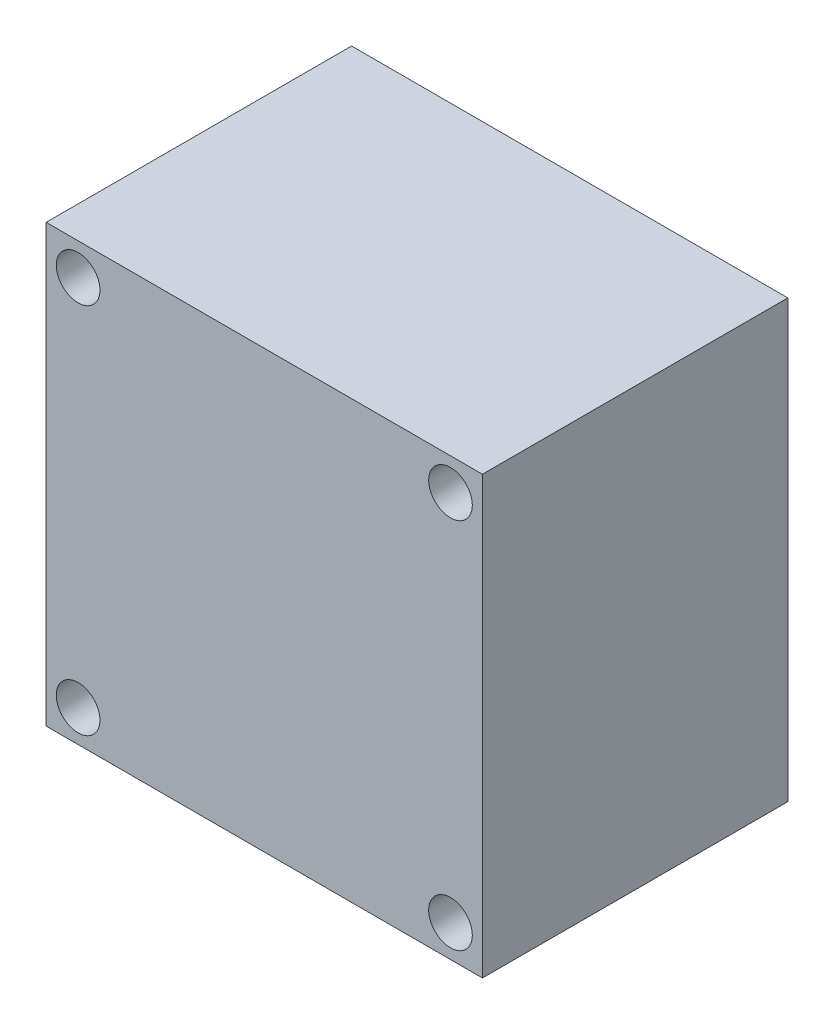
ISO-10303-21;
HEADER;
FILE_DESCRIPTION(('STEP AP214'),'2;1');
FILE_NAME('part.step','',(''),(''),'','','');
FILE_SCHEMA(('AUTOMOTIVE_DESIGN { 1 0 10303 214 1 1 1 1 }'));
ENDSEC;
DATA;
#1=APPLICATION_CONTEXT('core data for automotive mechanical design processes');
#2=APPLICATION_PROTOCOL_DEFINITION('international standard','automotive_design',2000,#1);
#3=PRODUCT_CONTEXT('',#1,'mechanical');
#4=PRODUCT('Part','Part','',(#3));
#5=PRODUCT_RELATED_PRODUCT_CATEGORY('part','',(#4));
#6=PRODUCT_DEFINITION_FORMATION('','',#4);
#7=PRODUCT_DEFINITION_CONTEXT('part definition',#1,'design');
#8=PRODUCT_DEFINITION('design','',#6,#7);
#9=PRODUCT_DEFINITION_SHAPE('','',#8);
#10=(LENGTH_UNIT() NAMED_UNIT(*) SI_UNIT(.MILLI.,.METRE.));
#11=(NAMED_UNIT(*) PLANE_ANGLE_UNIT() SI_UNIT($,.RADIAN.));
#12=(NAMED_UNIT(*) SI_UNIT($,.STERADIAN.) SOLID_ANGLE_UNIT());
#13=UNCERTAINTY_MEASURE_WITH_UNIT(LENGTH_MEASURE(1.E-05),#10,'distance_accuracy_value','');
#14=(GEOMETRIC_REPRESENTATION_CONTEXT(3) GLOBAL_UNCERTAINTY_ASSIGNED_CONTEXT((#13)) GLOBAL_UNIT_ASSIGNED_CONTEXT((#10,
#11,#12)) REPRESENTATION_CONTEXT('',''));
#15=CARTESIAN_POINT('',(0.,0.,0.));
#16=DIRECTION('',(0.,0.,1.));
#17=DIRECTION('',(1.,0.,0.));
#18=AXIS2_PLACEMENT_3D('',#15,#16,#17);
#19=CARTESIAN_POINT('',(20.,20.,28.));
#20=DIRECTION('',(-1.,0.,0.));
#21=DIRECTION('',(0.,-1.,0.));
#22=AXIS2_PLACEMENT_3D('',#19,#20,#21);
#23=PLANE('',#22);
#24=DIRECTION('',(0.,1.,0.));
#25=VECTOR('',#24,1.);
#26=CARTESIAN_POINT('',(20.,20.,0.));
#27=LINE('',#26,#25);
#28=CARTESIAN_POINT('',(20.,-20.,0.));
#29=VERTEX_POINT('',#28);
#30=CARTESIAN_POINT('',(20.,20.,0.));
#31=VERTEX_POINT('',#30);
#32=EDGE_CURVE('E102',#29,#31,#27,.T.);
#33=ORIENTED_EDGE('',*,*,#32,.T.);
#34=DIRECTION('',(0.,0.,-1.));
#35=VECTOR('',#34,1.);
#36=CARTESIAN_POINT('',(20.,20.,28.));
#37=LINE('',#36,#35);
#38=CARTESIAN_POINT('',(20.,20.,28.));
#39=VERTEX_POINT('',#38);
#40=EDGE_CURVE('E11',#39,#31,#37,.T.);
#41=ORIENTED_EDGE('',*,*,#40,.F.);
#42=DIRECTION('',(0.,1.,0.));
#43=VECTOR('',#42,1.);
#44=CARTESIAN_POINT('',(20.,20.,28.));
#45=LINE('',#44,#43);
#46=CARTESIAN_POINT('',(20.,-20.,28.));
#47=VERTEX_POINT('',#46);
#48=EDGE_CURVE('E90',#47,#39,#45,.T.);
#49=ORIENTED_EDGE('',*,*,#48,.F.);
#50=DIRECTION('',(0.,0.,-1.));
#51=VECTOR('',#50,1.);
#52=CARTESIAN_POINT('',(20.,-20.,28.));
#53=LINE('',#52,#51);
#54=EDGE_CURVE('E98',#47,#29,#53,.T.);
#55=ORIENTED_EDGE('',*,*,#54,.T.);
#56=EDGE_LOOP('',(#33,#41,#49,#55));
#57=FACE_BOUND('',#56,.T.);
#58=ADVANCED_FACE('F39',(#57),#23,.F.);
#59=CARTESIAN_POINT('',(-20.,20.,28.));
#60=DIRECTION('',(0.,-1.,0.));
#61=DIRECTION('',(0.,0.,-1.));
#62=AXIS2_PLACEMENT_3D('',#59,#60,#61);
#63=PLANE('',#62);
#64=DIRECTION('',(-1.,0.,0.));
#65=VECTOR('',#64,1.);
#66=CARTESIAN_POINT('',(-20.,20.,0.));
#67=LINE('',#66,#65);
#68=CARTESIAN_POINT('',(-20.,20.,0.));
#69=VERTEX_POINT('',#68);
#70=EDGE_CURVE('E94',#31,#69,#67,.T.);
#71=ORIENTED_EDGE('',*,*,#70,.T.);
#72=DIRECTION('',(0.,0.,-1.));
#73=VECTOR('',#72,1.);
#74=CARTESIAN_POINT('',(-20.,20.,28.));
#75=LINE('',#74,#73);
#76=CARTESIAN_POINT('',(-20.,20.,28.));
#77=VERTEX_POINT('',#76);
#78=EDGE_CURVE('E47',#77,#69,#75,.T.);
#79=ORIENTED_EDGE('',*,*,#78,.F.);
#80=DIRECTION('',(-1.,0.,0.));
#81=VECTOR('',#80,1.);
#82=CARTESIAN_POINT('',(-20.,20.,28.));
#83=LINE('',#82,#81);
#84=EDGE_CURVE('E85',#39,#77,#83,.T.);
#85=ORIENTED_EDGE('',*,*,#84,.F.);
#86=ORIENTED_EDGE('',*,*,#40,.T.);
#87=EDGE_LOOP('',(#71,#79,#85,#86));
#88=FACE_BOUND('',#87,.T.);
#89=ADVANCED_FACE('F93',(#88),#63,.F.);
#90=CARTESIAN_POINT('',(-20.,20.,28.));
#91=DIRECTION('',(1.,0.,0.));
#92=DIRECTION('',(0.,1.,0.));
#93=AXIS2_PLACEMENT_3D('',#90,#91,#92);
#94=PLANE('',#93);
#95=DIRECTION('',(0.,-1.,0.));
#96=VECTOR('',#95,1.);
#97=CARTESIAN_POINT('',(-20.,20.,0.));
#98=LINE('',#97,#96);
#99=CARTESIAN_POINT('',(-20.,-20.,0.));
#100=VERTEX_POINT('',#99);
#101=EDGE_CURVE('E72',#69,#100,#98,.T.);
#102=ORIENTED_EDGE('',*,*,#101,.T.);
#103=DIRECTION('',(0.,0.,-1.));
#104=VECTOR('',#103,1.);
#105=CARTESIAN_POINT('',(-20.,-20.,28.));
#106=LINE('',#105,#104);
#107=CARTESIAN_POINT('',(-20.,-20.,28.));
#108=VERTEX_POINT('',#107);
#109=EDGE_CURVE('E95',#108,#100,#106,.T.);
#110=ORIENTED_EDGE('',*,*,#109,.F.);
#111=DIRECTION('',(0.,-1.,0.));
#112=VECTOR('',#111,1.);
#113=CARTESIAN_POINT('',(-20.,20.,28.));
#114=LINE('',#113,#112);
#115=EDGE_CURVE('E88',#77,#108,#114,.T.);
#116=ORIENTED_EDGE('',*,*,#115,.F.);
#117=ORIENTED_EDGE('',*,*,#78,.T.);
#118=EDGE_LOOP('',(#102,#110,#116,#117));
#119=FACE_BOUND('',#118,.T.);
#120=ADVANCED_FACE('F96',(#119),#94,.F.);
#121=CARTESIAN_POINT('',(-20.,-20.,28.));
#122=DIRECTION('',(0.,1.,0.));
#123=DIRECTION('',(0.,0.,1.));
#124=AXIS2_PLACEMENT_3D('',#121,#122,#123);
#125=PLANE('',#124);
#126=DIRECTION('',(1.,0.,0.));
#127=VECTOR('',#126,1.);
#128=CARTESIAN_POINT('',(-20.,-20.,0.));
#129=LINE('',#128,#127);
#130=EDGE_CURVE('E78',#100,#29,#129,.T.);
#131=ORIENTED_EDGE('',*,*,#130,.T.);
#132=ORIENTED_EDGE('',*,*,#54,.F.);
#133=DIRECTION('',(1.,0.,0.));
#134=VECTOR('',#133,1.);
#135=CARTESIAN_POINT('',(-20.,-20.,28.));
#136=LINE('',#135,#134);
#137=EDGE_CURVE('E55',#108,#47,#136,.T.);
#138=ORIENTED_EDGE('',*,*,#137,.F.);
#139=ORIENTED_EDGE('',*,*,#109,.T.);
#140=EDGE_LOOP('',(#131,#132,#138,#139));
#141=FACE_BOUND('',#140,.T.);
#142=ADVANCED_FACE('F110',(#141),#125,.F.);
#143=CARTESIAN_POINT('',(0.,0.,28.));
#144=DIRECTION('',(0.,0.,1.));
#145=DIRECTION('',(1.,0.,0.));
#146=AXIS2_PLACEMENT_3D('',#143,#144,#145);
#147=PLANE('',#146);
#148=CARTESIAN_POINT('',(-17.0710678118655,-17.0710678118655,28.));
#149=DIRECTION('',(0.,0.,1.));
#150=DIRECTION('',(1.,0.,0.));
#151=AXIS2_PLACEMENT_3D('',#148,#149,#150);
#152=CIRCLE('',#151,2.);
#153=CARTESIAN_POINT('',(-15.0710678118655,-17.0710678118655,28.));
#154=VERTEX_POINT('',#153);
#155=EDGE_CURVE('E119',#154,#154,#152,.T.);
#156=ORIENTED_EDGE('',*,*,#155,.F.);
#157=EDGE_LOOP('',(#156));
#158=FACE_BOUND('',#157,.T.);
#159=CARTESIAN_POINT('',(17.0710678118655,17.0710678118655,28.));
#160=DIRECTION('',(0.,0.,1.));
#161=DIRECTION('',(1.,0.,0.));
#162=AXIS2_PLACEMENT_3D('',#159,#160,#161);
#163=CIRCLE('',#162,2.);
#164=CARTESIAN_POINT('',(19.0710678118655,17.0710678118655,28.));
#165=VERTEX_POINT('',#164);
#166=EDGE_CURVE('E125',#165,#165,#163,.T.);
#167=ORIENTED_EDGE('',*,*,#166,.F.);
#168=EDGE_LOOP('',(#167));
#169=FACE_BOUND('',#168,.T.);
#170=CARTESIAN_POINT('',(17.0710678118655,-17.0710678118655,28.));
#171=DIRECTION('',(0.,0.,1.));
#172=DIRECTION('',(1.,0.,0.));
#173=AXIS2_PLACEMENT_3D('',#170,#171,#172);
#174=CIRCLE('',#173,2.);
#175=CARTESIAN_POINT('',(19.0710678118655,-17.0710678118655,28.));
#176=VERTEX_POINT('',#175);
#177=EDGE_CURVE('E126',#176,#176,#174,.T.);
#178=ORIENTED_EDGE('',*,*,#177,.F.);
#179=EDGE_LOOP('',(#178));
#180=FACE_BOUND('',#179,.T.);
#181=CARTESIAN_POINT('',(-17.0710678118655,17.0710678118655,28.));
#182=DIRECTION('',(0.,0.,1.));
#183=DIRECTION('',(1.,0.,0.));
#184=AXIS2_PLACEMENT_3D('',#181,#182,#183);
#185=CIRCLE('',#184,2.);
#186=CARTESIAN_POINT('',(-15.0710678118655,17.0710678118655,28.));
#187=VERTEX_POINT('',#186);
#188=EDGE_CURVE('E116',#187,#187,#185,.T.);
#189=ORIENTED_EDGE('',*,*,#188,.F.);
#190=EDGE_LOOP('',(#189));
#191=FACE_BOUND('',#190,.T.);
#192=ORIENTED_EDGE('',*,*,#48,.T.);
#193=ORIENTED_EDGE('',*,*,#84,.T.);
#194=ORIENTED_EDGE('',*,*,#115,.T.);
#195=ORIENTED_EDGE('',*,*,#137,.T.);
#196=EDGE_LOOP('',(#192,#193,#194,#195));
#197=FACE_BOUND('',#196,.T.);
#198=ADVANCED_FACE('F86',(#158,#169,#180,#191,#197),#147,.T.);
#199=CARTESIAN_POINT('',(0.,0.,0.));
#200=DIRECTION('',(0.,0.,1.));
#201=DIRECTION('',(1.,0.,0.));
#202=AXIS2_PLACEMENT_3D('',#199,#200,#201);
#203=PLANE('',#202);
#204=CARTESIAN_POINT('',(-17.0710678118655,-17.0710678118655,0.));
#205=DIRECTION('',(0.,0.,1.));
#206=DIRECTION('',(1.,0.,0.));
#207=AXIS2_PLACEMENT_3D('',#204,#205,#206);
#208=CIRCLE('',#207,2.);
#209=CARTESIAN_POINT('',(-15.0710678118655,-17.0710678118655,0.));
#210=VERTEX_POINT('',#209);
#211=EDGE_CURVE('E129',#210,#210,#208,.T.);
#212=ORIENTED_EDGE('',*,*,#211,.T.);
#213=EDGE_LOOP('',(#212));
#214=FACE_BOUND('',#213,.T.);
#215=CARTESIAN_POINT('',(17.0710678118655,17.0710678118655,0.));
#216=DIRECTION('',(0.,0.,1.));
#217=DIRECTION('',(1.,0.,0.));
#218=AXIS2_PLACEMENT_3D('',#215,#216,#217);
#219=CIRCLE('',#218,2.);
#220=CARTESIAN_POINT('',(19.0710678118655,17.0710678118655,0.));
#221=VERTEX_POINT('',#220);
#222=EDGE_CURVE('E122',#221,#221,#219,.T.);
#223=ORIENTED_EDGE('',*,*,#222,.T.);
#224=EDGE_LOOP('',(#223));
#225=FACE_BOUND('',#224,.T.);
#226=CARTESIAN_POINT('',(17.0710678118655,-17.0710678118655,0.));
#227=DIRECTION('',(0.,0.,1.));
#228=DIRECTION('',(1.,0.,0.));
#229=AXIS2_PLACEMENT_3D('',#226,#227,#228);
#230=CIRCLE('',#229,2.);
#231=CARTESIAN_POINT('',(19.0710678118655,-17.0710678118655,0.));
#232=VERTEX_POINT('',#231);
#233=EDGE_CURVE('E134',#232,#232,#230,.T.);
#234=ORIENTED_EDGE('',*,*,#233,.T.);
#235=EDGE_LOOP('',(#234));
#236=FACE_BOUND('',#235,.T.);
#237=CARTESIAN_POINT('',(-17.0710678118655,17.0710678118655,0.));
#238=DIRECTION('',(0.,0.,1.));
#239=DIRECTION('',(1.,0.,0.));
#240=AXIS2_PLACEMENT_3D('',#237,#238,#239);
#241=CIRCLE('',#240,2.);
#242=CARTESIAN_POINT('',(-15.0710678118655,17.0710678118655,0.));
#243=VERTEX_POINT('',#242);
#244=EDGE_CURVE('E105',#243,#243,#241,.T.);
#245=ORIENTED_EDGE('',*,*,#244,.T.);
#246=EDGE_LOOP('',(#245));
#247=FACE_BOUND('',#246,.T.);
#248=ORIENTED_EDGE('',*,*,#32,.F.);
#249=ORIENTED_EDGE('',*,*,#130,.F.);
#250=ORIENTED_EDGE('',*,*,#101,.F.);
#251=ORIENTED_EDGE('',*,*,#70,.F.);
#252=EDGE_LOOP('',(#248,#249,#250,#251));
#253=FACE_BOUND('',#252,.T.);
#254=ADVANCED_FACE('F113',(#214,#225,#236,#247,#253),#203,.F.);
#255=CARTESIAN_POINT('',(-17.0710678118655,17.0710678118655,0.));
#256=DIRECTION('',(0.,0.,1.));
#257=DIRECTION('',(1.,0.,0.));
#258=AXIS2_PLACEMENT_3D('',#255,#256,#257);
#259=CYLINDRICAL_SURFACE('',#258,2.);
#260=ORIENTED_EDGE('',*,*,#244,.F.);
#261=EDGE_LOOP('',(#260));
#262=FACE_BOUND('',#261,.T.);
#263=ORIENTED_EDGE('',*,*,#188,.T.);
#264=EDGE_LOOP('',(#263));
#265=FACE_BOUND('',#264,.T.);
#266=ADVANCED_FACE('F148',(#262,#265),#259,.F.);
#267=CARTESIAN_POINT('',(17.0710678118655,-17.0710678118655,0.));
#268=DIRECTION('',(0.,0.,1.));
#269=DIRECTION('',(1.,0.,0.));
#270=AXIS2_PLACEMENT_3D('',#267,#268,#269);
#271=CYLINDRICAL_SURFACE('',#270,2.);
#272=ORIENTED_EDGE('',*,*,#233,.F.);
#273=EDGE_LOOP('',(#272));
#274=FACE_BOUND('',#273,.T.);
#275=ORIENTED_EDGE('',*,*,#177,.T.);
#276=EDGE_LOOP('',(#275));
#277=FACE_BOUND('',#276,.T.);
#278=ADVANCED_FACE('F140',(#274,#277),#271,.F.);
#279=CARTESIAN_POINT('',(17.0710678118655,17.0710678118655,0.));
#280=DIRECTION('',(0.,0.,1.));
#281=DIRECTION('',(1.,0.,0.));
#282=AXIS2_PLACEMENT_3D('',#279,#280,#281);
#283=CYLINDRICAL_SURFACE('',#282,2.);
#284=ORIENTED_EDGE('',*,*,#222,.F.);
#285=EDGE_LOOP('',(#284));
#286=FACE_BOUND('',#285,.T.);
#287=ORIENTED_EDGE('',*,*,#166,.T.);
#288=EDGE_LOOP('',(#287));
#289=FACE_BOUND('',#288,.T.);
#290=ADVANCED_FACE('F156',(#286,#289),#283,.F.);
#291=CARTESIAN_POINT('',(-17.0710678118655,-17.0710678118655,0.));
#292=DIRECTION('',(0.,0.,1.));
#293=DIRECTION('',(1.,0.,0.));
#294=AXIS2_PLACEMENT_3D('',#291,#292,#293);
#295=CYLINDRICAL_SURFACE('',#294,2.);
#296=ORIENTED_EDGE('',*,*,#211,.F.);
#297=EDGE_LOOP('',(#296));
#298=FACE_BOUND('',#297,.T.);
#299=ORIENTED_EDGE('',*,*,#155,.T.);
#300=EDGE_LOOP('',(#299));
#301=FACE_BOUND('',#300,.T.);
#302=ADVANCED_FACE('F207',(#298,#301),#295,.F.);
#303=CLOSED_SHELL('',(#58,#89,#120,#142,#198,#254,#266,#278,#290,#302));
#304=MANIFOLD_SOLID_BREP('B2',#303);
#305=ADVANCED_BREP_SHAPE_REPRESENTATION('',(#18,#304),#14);
#306=SHAPE_DEFINITION_REPRESENTATION(#9,#305);
ENDSEC;
END-ISO-10303-21;
